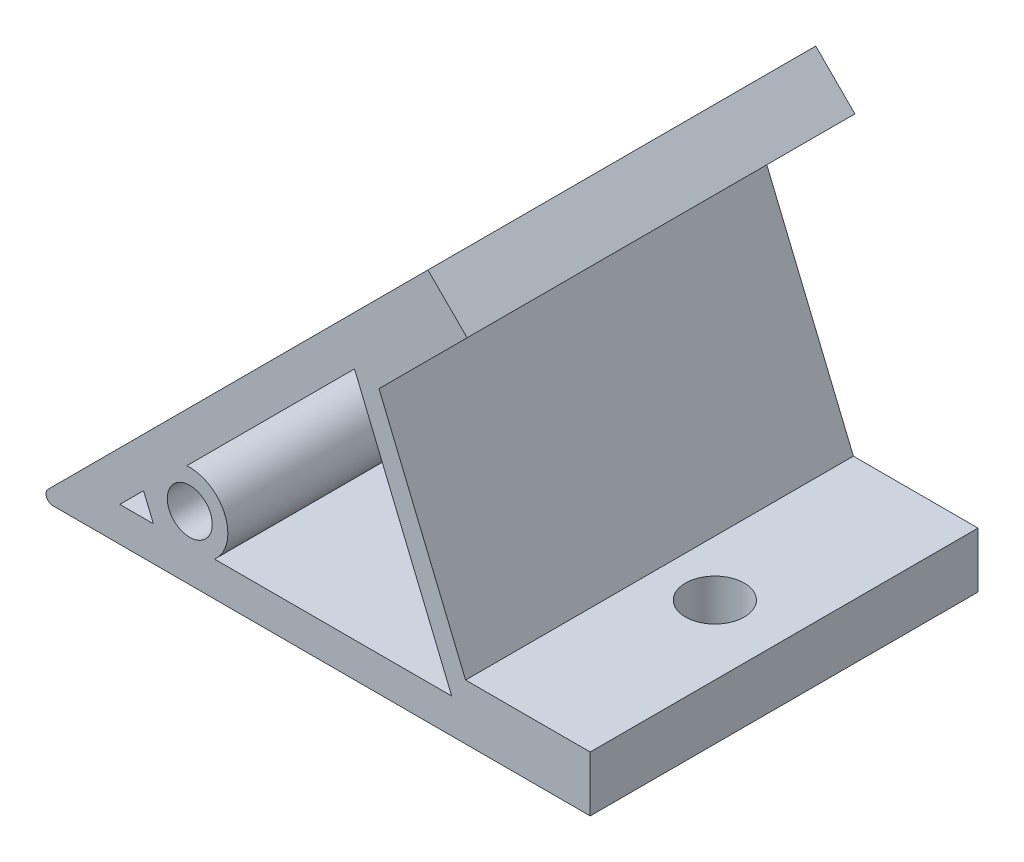
ISO-10303-21;
HEADER;
FILE_DESCRIPTION(('STEP AP214'),'2;1');
FILE_NAME('part.step','',(''),(''),'','','');
FILE_SCHEMA(('AUTOMOTIVE_DESIGN { 1 0 10303 214 1 1 1 1 }'));
ENDSEC;
DATA;
#1=APPLICATION_CONTEXT('core data for automotive mechanical design processes');
#2=APPLICATION_PROTOCOL_DEFINITION('international standard','automotive_design',2000,#1);
#3=PRODUCT_CONTEXT('',#1,'mechanical');
#4=PRODUCT('Part','Part','',(#3));
#5=PRODUCT_RELATED_PRODUCT_CATEGORY('part','',(#4));
#6=PRODUCT_DEFINITION_FORMATION('','',#4);
#7=PRODUCT_DEFINITION_CONTEXT('part definition',#1,'design');
#8=PRODUCT_DEFINITION('design','',#6,#7);
#9=PRODUCT_DEFINITION_SHAPE('','',#8);
#10=(LENGTH_UNIT() NAMED_UNIT(*) SI_UNIT(.MILLI.,.METRE.));
#11=(NAMED_UNIT(*) PLANE_ANGLE_UNIT() SI_UNIT($,.RADIAN.));
#12=(NAMED_UNIT(*) SI_UNIT($,.STERADIAN.) SOLID_ANGLE_UNIT());
#13=UNCERTAINTY_MEASURE_WITH_UNIT(LENGTH_MEASURE(1.E-05),#10,'distance_accuracy_value','');
#14=(GEOMETRIC_REPRESENTATION_CONTEXT(3) GLOBAL_UNCERTAINTY_ASSIGNED_CONTEXT((#13)) GLOBAL_UNIT_ASSIGNED_CONTEXT((#10,
#11,#12)) REPRESENTATION_CONTEXT('',''));
#15=CARTESIAN_POINT('',(0.,0.,0.));
#16=DIRECTION('',(0.,0.,1.));
#17=DIRECTION('',(1.,0.,0.));
#18=AXIS2_PLACEMENT_3D('',#15,#16,#17);
#19=CARTESIAN_POINT('',(-30.4993179415646,38.1869735594505,28.));
#20=DIRECTION('',(-0.707106781186548,0.707106781186547,0.));
#21=DIRECTION('',(-0.707106781186547,-0.707106781186548,0.));
#22=AXIS2_PLACEMENT_3D('',#19,#20,#21);
#23=PLANE('',#22);
#24=DIRECTION('',(0.707106781186547,0.707106781186548,0.));
#25=VECTOR('',#24,1.);
#26=CARTESIAN_POINT('',(-30.4993179415646,38.1869735594505,-28.));
#27=LINE('',#26,#25);
#28=CARTESIAN_POINT('',(-30.4993179415646,38.1869735594505,-28.));
#29=VERTEX_POINT('',#28);
#30=CARTESIAN_POINT('',(-17.7746032555838,50.9116882454314,-28.));
#31=VERTEX_POINT('',#30);
#32=EDGE_CURVE('E236',#29,#31,#27,.T.);
#33=ORIENTED_EDGE('',*,*,#32,.T.);
#34=DIRECTION('',(0.,0.,-1.));
#35=VECTOR('',#34,1.);
#36=CARTESIAN_POINT('',(-17.7746032555838,50.9116882454314,28.));
#37=LINE('',#36,#35);
#38=CARTESIAN_POINT('',(-17.7746032555838,50.9116882454314,28.));
#39=VERTEX_POINT('',#38);
#40=EDGE_CURVE('E246',#39,#31,#37,.T.);
#41=ORIENTED_EDGE('',*,*,#40,.F.);
#42=DIRECTION('',(0.707106781186547,0.707106781186548,0.));
#43=VECTOR('',#42,1.);
#44=CARTESIAN_POINT('',(-30.4993179415646,38.1869735594505,28.));
#45=LINE('',#44,#43);
#46=CARTESIAN_POINT('',(-30.4993179415646,38.1869735594505,28.));
#47=VERTEX_POINT('',#46);
#48=EDGE_CURVE('E219',#47,#39,#45,.T.);
#49=ORIENTED_EDGE('',*,*,#48,.F.);
#50=DIRECTION('',(0.,0.,-1.));
#51=VECTOR('',#50,1.);
#52=CARTESIAN_POINT('',(-30.4993179415646,38.1869735594505,28.));
#53=LINE('',#52,#51);
#54=EDGE_CURVE('E249',#47,#29,#53,.T.);
#55=ORIENTED_EDGE('',*,*,#54,.T.);
#56=EDGE_LOOP('',(#33,#41,#49,#55));
#57=FACE_BOUND('',#56,.T.);
#58=CARTESIAN_POINT('',(-24.8456710674492,43.8406204335659,0.));
#59=DIRECTION('',(-0.70710678118655,0.707106781186545,0.));
#60=DIRECTION('',(-0.707106781186546,-0.707106781186549,0.));
#61=AXIS2_PLACEMENT_3D('',#58,#59,#60);
#62=CIRCLE('',#61,4.25);
#63=CARTESIAN_POINT('',(-27.850874887492,40.835416613523,0.));
#64=VERTEX_POINT('',#63);
#65=EDGE_CURVE('E305',#64,#64,#62,.T.);
#66=ORIENTED_EDGE('',*,*,#65,.T.);
#67=EDGE_LOOP('',(#66));
#68=FACE_BOUND('',#67,.T.);
#69=ADVANCED_FACE('F35',(#57,#68),#23,.F.);
#70=CARTESIAN_POINT('',(-78.2928932188134,1.7071067811866,28.));
#71=DIRECTION('',(0.707106781186548,-0.707106781186548,0.));
#72=DIRECTION('',(0.707106781186547,0.707106781186548,0.));
#73=AXIS2_PLACEMENT_3D('',#70,#71,#72);
#74=PLANE('',#73);
#75=DIRECTION('',(-0.707106781186547,-0.707106781186548,0.));
#76=VECTOR('',#75,1.);
#77=CARTESIAN_POINT('',(-78.2928932188134,1.7071067811866,-28.));
#78=LINE('',#77,#76);
#79=CARTESIAN_POINT('',(-23.4314575050762,56.5685424949238,-28.));
#80=VERTEX_POINT('',#79);
#81=CARTESIAN_POINT('',(-78.2928932188134,1.7071067811866,-28.));
#82=VERTEX_POINT('',#81);
#83=EDGE_CURVE('E211',#80,#82,#78,.T.);
#84=ORIENTED_EDGE('',*,*,#83,.T.);
#85=DIRECTION('',(0.,0.,-1.));
#86=VECTOR('',#85,1.);
#87=CARTESIAN_POINT('',(-78.2928932188134,1.7071067811866,28.));
#88=LINE('',#87,#86);
#89=CARTESIAN_POINT('',(-78.2928932188134,1.7071067811866,28.));
#90=VERTEX_POINT('',#89);
#91=EDGE_CURVE('E225',#90,#82,#88,.T.);
#92=ORIENTED_EDGE('',*,*,#91,.F.);
#93=DIRECTION('',(-0.707106781186547,-0.707106781186548,0.));
#94=VECTOR('',#93,1.);
#95=CARTESIAN_POINT('',(-78.2928932188134,1.7071067811866,28.));
#96=LINE('',#95,#94);
#97=CARTESIAN_POINT('',(-23.4314575050762,56.5685424949238,28.));
#98=VERTEX_POINT('',#97);
#99=EDGE_CURVE('E223',#98,#90,#96,.T.);
#100=ORIENTED_EDGE('',*,*,#99,.F.);
#101=DIRECTION('',(0.,0.,-1.));
#102=VECTOR('',#101,1.);
#103=CARTESIAN_POINT('',(-23.4314575050762,56.5685424949238,28.));
#104=LINE('',#103,#102);
#105=EDGE_CURVE('E243',#98,#80,#104,.T.);
#106=ORIENTED_EDGE('',*,*,#105,.T.);
#107=EDGE_LOOP('',(#84,#92,#100,#106));
#108=FACE_BOUND('',#107,.T.);
#109=CARTESIAN_POINT('',(-30.5025253169417,49.4974746830583,0.));
#110=DIRECTION('',(0.707106781186548,-0.707106781186548,0.));
#111=DIRECTION('',(0.707106781186547,0.707106781186548,0.));
#112=AXIS2_PLACEMENT_3D('',#109,#110,#111);
#113=CIRCLE('',#112,4.25);
#114=CARTESIAN_POINT('',(-27.4973214968988,52.5026785031012,0.));
#115=VERTEX_POINT('',#114);
#116=EDGE_CURVE('E39',#115,#115,#113,.F.);
#117=ORIENTED_EDGE('',*,*,#116,.F.);
#118=EDGE_LOOP('',(#117));
#119=FACE_BOUND('',#118,.T.);
#120=ADVANCED_FACE('F292',(#108,#119),#74,.F.);
#121=CARTESIAN_POINT('',(-77.5857864376269,1.,28.));
#122=DIRECTION('',(0.,0.,1.));
#123=DIRECTION('',(1.,0.,0.));
#124=AXIS2_PLACEMENT_3D('',#121,#122,#123);
#125=PLANE('',#124);
#126=DIRECTION('',(1.,0.,0.));
#127=VECTOR('',#126,1.);
#128=CARTESIAN_POINT('',(-54.2574687525298,5.,28.));
#129=LINE('',#128,#127);
#130=CARTESIAN_POINT('',(-54.2574687525298,5.,28.));
#131=VERTEX_POINT('',#130);
#132=CARTESIAN_POINT('',(-20.,5.,28.));
#133=VERTEX_POINT('',#132);
#134=EDGE_CURVE('E151',#131,#133,#129,.T.);
#135=ORIENTED_EDGE('',*,*,#134,.F.);
#136=CARTESIAN_POINT('',(-57.8268912197291,9.18440237676214,28.));
#137=DIRECTION('',(0.,0.,-1.));
#138=DIRECTION('',(1.,0.,0.));
#139=AXIS2_PLACEMENT_3D('',#136,#137,#138);
#140=CIRCLE('',#139,5.49999999999996);
#141=CARTESIAN_POINT('',(-58.2617476840749,14.6671845040599,28.));
#142=VERTEX_POINT('',#141);
#143=EDGE_CURVE('E143',#142,#131,#140,.T.);
#144=ORIENTED_EDGE('',*,*,#143,.F.);
#145=DIRECTION('',(-0.707106781186549,-0.707106781186546,0.));
#146=VECTOR('',#145,1.);
#147=CARTESIAN_POINT('',(-58.2617476840749,14.6671845040599,28.));
#148=LINE('',#147,#146);
#149=CARTESIAN_POINT('',(-34.0380592228744,38.8908729652603,28.));
#150=VERTEX_POINT('',#149);
#151=EDGE_CURVE('E167',#150,#142,#148,.T.);
#152=ORIENTED_EDGE('',*,*,#151,.F.);
#153=DIRECTION('',(-0.382683432365087,0.923879532511288,0.));
#154=VECTOR('',#153,1.);
#155=CARTESIAN_POINT('',(-20.,5.,28.));
#156=LINE('',#155,#154);
#157=EDGE_CURVE('E165',#133,#150,#156,.T.);
#158=ORIENTED_EDGE('',*,*,#157,.F.);
#159=EDGE_LOOP('',(#135,#144,#152,#158));
#160=FACE_BOUND('',#159,.T.);
#161=CARTESIAN_POINT('',(-77.5857864376269,1.,28.));
#162=DIRECTION('',(0.,0.,1.));
#163=DIRECTION('',(1.,0.,0.));
#164=AXIS2_PLACEMENT_3D('',#161,#162,#163);
#165=CIRCLE('',#164,1.);
#166=CARTESIAN_POINT('',(-77.5857864376269,0.,28.));
#167=VERTEX_POINT('',#166);
#168=EDGE_CURVE('E207',#90,#167,#165,.T.);
#169=ORIENTED_EDGE('',*,*,#168,.T.);
#170=DIRECTION('',(1.,0.,0.));
#171=VECTOR('',#170,1.);
#172=CARTESIAN_POINT('',(-77.5857864376269,0.,28.));
#173=LINE('',#172,#171);
#174=CARTESIAN_POINT('',(0.,0.,28.));
#175=VERTEX_POINT('',#174);
#176=EDGE_CURVE('E210',#167,#175,#173,.T.);
#177=ORIENTED_EDGE('',*,*,#176,.T.);
#178=DIRECTION('',(0.,1.,0.));
#179=VECTOR('',#178,1.);
#180=CARTESIAN_POINT('',(0.,0.,28.));
#181=LINE('',#180,#179);
#182=CARTESIAN_POINT('',(0.,8.,28.));
#183=VERTEX_POINT('',#182);
#184=EDGE_CURVE('E213',#175,#183,#181,.T.);
#185=ORIENTED_EDGE('',*,*,#184,.T.);
#186=DIRECTION('',(-1.,0.,0.));
#187=VECTOR('',#186,1.);
#188=CARTESIAN_POINT('',(-17.995464086242,8.00000000000012,28.));
#189=LINE('',#188,#187);
#190=CARTESIAN_POINT('',(-17.995464086242,8.00000000000012,28.));
#191=VERTEX_POINT('',#190);
#192=EDGE_CURVE('E215',#183,#191,#189,.T.);
#193=ORIENTED_EDGE('',*,*,#192,.T.);
#194=DIRECTION('',(-0.382683432365096,0.923879532511284,0.));
#195=VECTOR('',#194,1.);
#196=CARTESIAN_POINT('',(-17.995464086242,8.00000000000012,28.));
#197=LINE('',#196,#195);
#198=EDGE_CURVE('E217',#191,#47,#197,.T.);
#199=ORIENTED_EDGE('',*,*,#198,.T.);
#200=ORIENTED_EDGE('',*,*,#48,.T.);
#201=DIRECTION('',(-0.707106781186548,0.707106781186547,0.));
#202=VECTOR('',#201,1.);
#203=CARTESIAN_POINT('',(-17.7746032555838,50.9116882454314,28.));
#204=LINE('',#203,#202);
#205=EDGE_CURVE('E221',#39,#98,#204,.T.);
#206=ORIENTED_EDGE('',*,*,#205,.T.);
#207=ORIENTED_EDGE('',*,*,#99,.T.);
#208=EDGE_LOOP('',(#169,#177,#185,#193,#199,#200,#206,#207));
#209=FACE_BOUND('',#208,.T.);
#210=DIRECTION('',(1.,0.,0.));
#211=VECTOR('',#210,1.);
#212=CARTESIAN_POINT('',(-67.9289321881347,5.,28.));
#213=LINE('',#212,#211);
#214=CARTESIAN_POINT('',(-67.9289321881347,5.,28.));
#215=VERTEX_POINT('',#214);
#216=CARTESIAN_POINT('',(-63.0744704704145,5.00000000000011,28.));
#217=VERTEX_POINT('',#216);
#218=EDGE_CURVE('E185',#215,#217,#213,.T.);
#219=ORIENTED_EDGE('',*,*,#218,.F.);
#220=DIRECTION('',(-0.70710678118656,-0.707106781186535,0.));
#221=VECTOR('',#220,1.);
#222=CARTESIAN_POINT('',(-67.9289321881347,5.,28.));
#223=LINE('',#222,#221);
#224=CARTESIAN_POINT('',(-64.4963093885244,8.43262279961016,28.));
#225=VERTEX_POINT('',#224);
#226=EDGE_CURVE('E183',#225,#215,#223,.T.);
#227=ORIENTED_EDGE('',*,*,#226,.F.);
#228=DIRECTION('',(-0.382683432365157,0.923879532511259,0.));
#229=VECTOR('',#228,1.);
#230=CARTESIAN_POINT('',(-63.0744704704145,5.00000000000011,28.));
#231=LINE('',#230,#229);
#232=EDGE_CURVE('E189',#217,#225,#231,.T.);
#233=ORIENTED_EDGE('',*,*,#232,.F.);
#234=EDGE_LOOP('',(#219,#227,#233));
#235=FACE_BOUND('',#234,.T.);
#236=CARTESIAN_POINT('',(-57.8268912197291,9.18440237676214,28.));
#237=DIRECTION('',(0.,0.,1.));
#238=DIRECTION('',(1.,0.,0.));
#239=AXIS2_PLACEMENT_3D('',#236,#237,#238);
#240=CIRCLE('',#239,3.25);
#241=CARTESIAN_POINT('',(-54.5768912197291,9.18440237676214,28.));
#242=VERTEX_POINT('',#241);
#243=EDGE_CURVE('E173',#242,#242,#240,.T.);
#244=ORIENTED_EDGE('',*,*,#243,.F.);
#245=EDGE_LOOP('',(#244));
#246=FACE_BOUND('',#245,.T.);
#247=ADVANCED_FACE('F163',(#160,#209,#235,#246),#125,.T.);
#248=CARTESIAN_POINT('',(-77.5857864376269,1.,-28.));
#249=DIRECTION('',(0.,0.,1.));
#250=DIRECTION('',(1.,0.,0.));
#251=AXIS2_PLACEMENT_3D('',#248,#249,#250);
#252=PLANE('',#251);
#253=CARTESIAN_POINT('',(-57.8268912197291,9.18440237676214,-28.));
#254=DIRECTION('',(0.,0.,-1.));
#255=DIRECTION('',(1.,0.,0.));
#256=AXIS2_PLACEMENT_3D('',#253,#254,#255);
#257=CIRCLE('',#256,5.49999999999996);
#258=CARTESIAN_POINT('',(-58.2617476840749,14.6671845040599,-28.));
#259=VERTEX_POINT('',#258);
#260=CARTESIAN_POINT('',(-54.2574687525298,5.,-28.));
#261=VERTEX_POINT('',#260);
#262=EDGE_CURVE('E59',#259,#261,#257,.T.);
#263=ORIENTED_EDGE('',*,*,#262,.T.);
#264=DIRECTION('',(1.,0.,0.));
#265=VECTOR('',#264,1.);
#266=CARTESIAN_POINT('',(-54.2574687525298,5.,-28.));
#267=LINE('',#266,#265);
#268=CARTESIAN_POINT('',(-20.,5.,-28.));
#269=VERTEX_POINT('',#268);
#270=EDGE_CURVE('E158',#261,#269,#267,.T.);
#271=ORIENTED_EDGE('',*,*,#270,.T.);
#272=DIRECTION('',(-0.382683432365087,0.923879532511288,0.));
#273=VECTOR('',#272,1.);
#274=CARTESIAN_POINT('',(-20.,5.,-28.));
#275=LINE('',#274,#273);
#276=CARTESIAN_POINT('',(-34.0380592228744,38.8908729652603,-28.));
#277=VERTEX_POINT('',#276);
#278=EDGE_CURVE('E175',#269,#277,#275,.T.);
#279=ORIENTED_EDGE('',*,*,#278,.T.);
#280=DIRECTION('',(-0.707106781186549,-0.707106781186546,0.));
#281=VECTOR('',#280,1.);
#282=CARTESIAN_POINT('',(-58.2617476840749,14.6671845040599,-28.));
#283=LINE('',#282,#281);
#284=EDGE_CURVE('E152',#277,#259,#283,.T.);
#285=ORIENTED_EDGE('',*,*,#284,.T.);
#286=EDGE_LOOP('',(#263,#271,#279,#285));
#287=FACE_BOUND('',#286,.T.);
#288=CARTESIAN_POINT('',(-77.5857864376269,1.,-28.));
#289=DIRECTION('',(0.,0.,1.));
#290=DIRECTION('',(1.,0.,0.));
#291=AXIS2_PLACEMENT_3D('',#288,#289,#290);
#292=CIRCLE('',#291,1.);
#293=CARTESIAN_POINT('',(-77.5857864376269,0.,-28.));
#294=VERTEX_POINT('',#293);
#295=EDGE_CURVE('E206',#82,#294,#292,.T.);
#296=ORIENTED_EDGE('',*,*,#295,.F.);
#297=ORIENTED_EDGE('',*,*,#83,.F.);
#298=DIRECTION('',(-0.707106781186548,0.707106781186547,0.));
#299=VECTOR('',#298,1.);
#300=CARTESIAN_POINT('',(-17.7746032555838,50.9116882454314,-28.));
#301=LINE('',#300,#299);
#302=EDGE_CURVE('E238',#31,#80,#301,.T.);
#303=ORIENTED_EDGE('',*,*,#302,.F.);
#304=ORIENTED_EDGE('',*,*,#32,.F.);
#305=DIRECTION('',(-0.382683432365096,0.923879532511284,0.));
#306=VECTOR('',#305,1.);
#307=CARTESIAN_POINT('',(-17.995464086242,8.00000000000012,-28.));
#308=LINE('',#307,#306);
#309=CARTESIAN_POINT('',(-17.995464086242,8.00000000000012,-28.));
#310=VERTEX_POINT('',#309);
#311=EDGE_CURVE('E234',#310,#29,#308,.T.);
#312=ORIENTED_EDGE('',*,*,#311,.F.);
#313=DIRECTION('',(-1.,0.,0.));
#314=VECTOR('',#313,1.);
#315=CARTESIAN_POINT('',(-17.995464086242,8.00000000000012,-28.));
#316=LINE('',#315,#314);
#317=CARTESIAN_POINT('',(0.,8.,-28.));
#318=VERTEX_POINT('',#317);
#319=EDGE_CURVE('E232',#318,#310,#316,.T.);
#320=ORIENTED_EDGE('',*,*,#319,.F.);
#321=DIRECTION('',(0.,1.,0.));
#322=VECTOR('',#321,1.);
#323=CARTESIAN_POINT('',(0.,0.,-28.));
#324=LINE('',#323,#322);
#325=CARTESIAN_POINT('',(0.,0.,-28.));
#326=VERTEX_POINT('',#325);
#327=EDGE_CURVE('E230',#326,#318,#324,.T.);
#328=ORIENTED_EDGE('',*,*,#327,.F.);
#329=DIRECTION('',(1.,0.,0.));
#330=VECTOR('',#329,1.);
#331=CARTESIAN_POINT('',(-77.5857864376269,0.,-28.));
#332=LINE('',#331,#330);
#333=EDGE_CURVE('E228',#294,#326,#332,.T.);
#334=ORIENTED_EDGE('',*,*,#333,.F.);
#335=EDGE_LOOP('',(#296,#297,#303,#304,#312,#320,#328,#334));
#336=FACE_BOUND('',#335,.T.);
#337=DIRECTION('',(-0.70710678118656,-0.707106781186535,0.));
#338=VECTOR('',#337,1.);
#339=CARTESIAN_POINT('',(-67.9289321881347,5.,-28.));
#340=LINE('',#339,#338);
#341=CARTESIAN_POINT('',(-64.4963093885244,8.43262279961016,-28.));
#342=VERTEX_POINT('',#341);
#343=CARTESIAN_POINT('',(-67.9289321881347,5.,-28.));
#344=VERTEX_POINT('',#343);
#345=EDGE_CURVE('E159',#342,#344,#340,.T.);
#346=ORIENTED_EDGE('',*,*,#345,.T.);
#347=DIRECTION('',(1.,0.,0.));
#348=VECTOR('',#347,1.);
#349=CARTESIAN_POINT('',(-67.9289321881347,5.,-28.));
#350=LINE('',#349,#348);
#351=CARTESIAN_POINT('',(-63.0744704704145,5.00000000000011,-28.));
#352=VERTEX_POINT('',#351);
#353=EDGE_CURVE('E194',#344,#352,#350,.T.);
#354=ORIENTED_EDGE('',*,*,#353,.T.);
#355=DIRECTION('',(-0.382683432365157,0.923879532511259,0.));
#356=VECTOR('',#355,1.);
#357=CARTESIAN_POINT('',(-63.0744704704145,5.00000000000011,-28.));
#358=LINE('',#357,#356);
#359=EDGE_CURVE('E186',#352,#342,#358,.T.);
#360=ORIENTED_EDGE('',*,*,#359,.T.);
#361=EDGE_LOOP('',(#346,#354,#360));
#362=FACE_BOUND('',#361,.T.);
#363=CARTESIAN_POINT('',(-57.8268912197291,9.18440237676214,-28.));
#364=DIRECTION('',(0.,0.,1.));
#365=DIRECTION('',(1.,0.,0.));
#366=AXIS2_PLACEMENT_3D('',#363,#364,#365);
#367=CIRCLE('',#366,3.25);
#368=CARTESIAN_POINT('',(-54.5768912197291,9.18440237676214,-28.));
#369=VERTEX_POINT('',#368);
#370=EDGE_CURVE('E316',#369,#369,#367,.T.);
#371=ORIENTED_EDGE('',*,*,#370,.T.);
#372=EDGE_LOOP('',(#371));
#373=FACE_BOUND('',#372,.T.);
#374=ADVANCED_FACE('F269',(#287,#336,#362,#373),#252,.F.);
#375=CARTESIAN_POINT('',(-77.5857864376269,1.,28.));
#376=DIRECTION('',(0.,0.,-1.));
#377=DIRECTION('',(-1.,0.,0.));
#378=AXIS2_PLACEMENT_3D('',#375,#376,#377);
#379=CYLINDRICAL_SURFACE('',#378,1.);
#380=ORIENTED_EDGE('',*,*,#295,.T.);
#381=DIRECTION('',(0.,0.,-1.));
#382=VECTOR('',#381,1.);
#383=CARTESIAN_POINT('',(-77.5857864376269,0.,28.));
#384=LINE('',#383,#382);
#385=EDGE_CURVE('E11',#167,#294,#384,.T.);
#386=ORIENTED_EDGE('',*,*,#385,.F.);
#387=ORIENTED_EDGE('',*,*,#168,.F.);
#388=ORIENTED_EDGE('',*,*,#91,.T.);
#389=EDGE_LOOP('',(#380,#386,#387,#388));
#390=FACE_BOUND('',#389,.T.);
#391=ADVANCED_FACE('F37',(#390),#379,.T.);
#392=CARTESIAN_POINT('',(-77.5857864376269,0.,28.));
#393=DIRECTION('',(0.,1.,0.));
#394=DIRECTION('',(0.,0.,1.));
#395=AXIS2_PLACEMENT_3D('',#392,#393,#394);
#396=PLANE('',#395);
#397=CARTESIAN_POINT('',(-10.,0.,0.));
#398=DIRECTION('',(0.,1.,0.));
#399=DIRECTION('',(0.,0.,1.));
#400=AXIS2_PLACEMENT_3D('',#397,#398,#399);
#401=CIRCLE('',#400,4.25);
#402=CARTESIAN_POINT('',(-10.,0.,4.25));
#403=VERTEX_POINT('',#402);
#404=EDGE_CURVE('E313',#403,#403,#401,.T.);
#405=ORIENTED_EDGE('',*,*,#404,.T.);
#406=EDGE_LOOP('',(#405));
#407=FACE_BOUND('',#406,.T.);
#408=ORIENTED_EDGE('',*,*,#333,.T.);
#409=DIRECTION('',(0.,0.,-1.));
#410=VECTOR('',#409,1.);
#411=CARTESIAN_POINT('',(0.,0.,28.));
#412=LINE('',#411,#410);
#413=EDGE_CURVE('E44',#175,#326,#412,.T.);
#414=ORIENTED_EDGE('',*,*,#413,.F.);
#415=ORIENTED_EDGE('',*,*,#176,.F.);
#416=ORIENTED_EDGE('',*,*,#385,.T.);
#417=EDGE_LOOP('',(#408,#414,#415,#416));
#418=FACE_BOUND('',#417,.T.);
#419=ADVANCED_FACE('F286',(#407,#418),#396,.F.);
#420=CARTESIAN_POINT('',(0.,0.,28.));
#421=DIRECTION('',(-1.,0.,0.));
#422=DIRECTION('',(0.,0.,1.));
#423=AXIS2_PLACEMENT_3D('',#420,#421,#422);
#424=PLANE('',#423);
#425=ORIENTED_EDGE('',*,*,#327,.T.);
#426=DIRECTION('',(0.,0.,-1.));
#427=VECTOR('',#426,1.);
#428=CARTESIAN_POINT('',(0.,8.,28.));
#429=LINE('',#428,#427);
#430=EDGE_CURVE('E255',#183,#318,#429,.T.);
#431=ORIENTED_EDGE('',*,*,#430,.F.);
#432=ORIENTED_EDGE('',*,*,#184,.F.);
#433=ORIENTED_EDGE('',*,*,#413,.T.);
#434=EDGE_LOOP('',(#425,#431,#432,#433));
#435=FACE_BOUND('',#434,.T.);
#436=ADVANCED_FACE('F263',(#435),#424,.F.);
#437=CARTESIAN_POINT('',(-17.995464086242,8.00000000000012,28.));
#438=DIRECTION('',(0.,-1.,0.));
#439=DIRECTION('',(1.,0.,0.));
#440=AXIS2_PLACEMENT_3D('',#437,#438,#439);
#441=PLANE('',#440);
#442=CARTESIAN_POINT('',(-10.,8.00000000000006,0.));
#443=DIRECTION('',(0.,1.,0.));
#444=DIRECTION('',(-1.,0.,0.));
#445=AXIS2_PLACEMENT_3D('',#442,#443,#444);
#446=CIRCLE('',#445,4.25);
#447=CARTESIAN_POINT('',(-14.25,8.00000000000009,0.));
#448=VERTEX_POINT('',#447);
#449=EDGE_CURVE('E309',#448,#448,#446,.T.);
#450=ORIENTED_EDGE('',*,*,#449,.F.);
#451=EDGE_LOOP('',(#450));
#452=FACE_BOUND('',#451,.T.);
#453=ORIENTED_EDGE('',*,*,#319,.T.);
#454=DIRECTION('',(0.,0.,-1.));
#455=VECTOR('',#454,1.);
#456=CARTESIAN_POINT('',(-17.995464086242,8.00000000000012,28.));
#457=LINE('',#456,#455);
#458=EDGE_CURVE('E252',#191,#310,#457,.T.);
#459=ORIENTED_EDGE('',*,*,#458,.F.);
#460=ORIENTED_EDGE('',*,*,#192,.F.);
#461=ORIENTED_EDGE('',*,*,#430,.T.);
#462=EDGE_LOOP('',(#453,#459,#460,#461));
#463=FACE_BOUND('',#462,.T.);
#464=ADVANCED_FACE('F275',(#452,#463),#441,.F.);
#465=CARTESIAN_POINT('',(-17.995464086242,8.00000000000012,28.));
#466=DIRECTION('',(-0.923879532511284,-0.382683432365096,0.));
#467=DIRECTION('',(0.382683432365096,-0.923879532511284,0.));
#468=AXIS2_PLACEMENT_3D('',#465,#466,#467);
#469=PLANE('',#468);
#470=ORIENTED_EDGE('',*,*,#311,.T.);
#471=ORIENTED_EDGE('',*,*,#54,.F.);
#472=ORIENTED_EDGE('',*,*,#198,.F.);
#473=ORIENTED_EDGE('',*,*,#458,.T.);
#474=EDGE_LOOP('',(#470,#471,#472,#473));
#475=FACE_BOUND('',#474,.T.);
#476=ADVANCED_FACE('F279',(#475),#469,.F.);
#477=CARTESIAN_POINT('',(-17.7746032555838,50.9116882454314,28.));
#478=DIRECTION('',(-0.707106781186547,-0.707106781186548,0.));
#479=DIRECTION('',(0.707106781186548,-0.707106781186547,0.));
#480=AXIS2_PLACEMENT_3D('',#477,#478,#479);
#481=PLANE('',#480);
#482=ORIENTED_EDGE('',*,*,#302,.T.);
#483=ORIENTED_EDGE('',*,*,#105,.F.);
#484=ORIENTED_EDGE('',*,*,#205,.F.);
#485=ORIENTED_EDGE('',*,*,#40,.T.);
#486=EDGE_LOOP('',(#482,#483,#484,#485));
#487=FACE_BOUND('',#486,.T.);
#488=ADVANCED_FACE('F298',(#487),#481,.F.);
#489=CARTESIAN_POINT('',(-67.9289321881347,5.,28.));
#490=DIRECTION('',(0.707106781186535,-0.70710678118656,0.));
#491=DIRECTION('',(0.70710678118656,0.707106781186535,0.));
#492=AXIS2_PLACEMENT_3D('',#489,#490,#491);
#493=PLANE('',#492);
#494=ORIENTED_EDGE('',*,*,#345,.F.);
#495=DIRECTION('',(0.,0.,-1.));
#496=VECTOR('',#495,1.);
#497=CARTESIAN_POINT('',(-64.4963093885244,8.43262279961016,28.));
#498=LINE('',#497,#496);
#499=EDGE_CURVE('E191',#225,#342,#498,.T.);
#500=ORIENTED_EDGE('',*,*,#499,.F.);
#501=ORIENTED_EDGE('',*,*,#226,.T.);
#502=DIRECTION('',(0.,0.,-1.));
#503=VECTOR('',#502,1.);
#504=CARTESIAN_POINT('',(-67.9289321881347,5.,28.));
#505=LINE('',#504,#503);
#506=EDGE_CURVE('E203',#215,#344,#505,.T.);
#507=ORIENTED_EDGE('',*,*,#506,.T.);
#508=EDGE_LOOP('',(#494,#500,#501,#507));
#509=FACE_BOUND('',#508,.T.);
#510=ADVANCED_FACE('F353',(#509),#493,.T.);
#511=CARTESIAN_POINT('',(-67.9289321881347,5.,28.));
#512=DIRECTION('',(0.,1.,0.));
#513=DIRECTION('',(-1.,0.,0.));
#514=AXIS2_PLACEMENT_3D('',#511,#512,#513);
#515=PLANE('',#514);
#516=ORIENTED_EDGE('',*,*,#353,.F.);
#517=ORIENTED_EDGE('',*,*,#506,.F.);
#518=ORIENTED_EDGE('',*,*,#218,.T.);
#519=DIRECTION('',(0.,0.,-1.));
#520=VECTOR('',#519,1.);
#521=CARTESIAN_POINT('',(-63.0744704704145,5.00000000000011,28.));
#522=LINE('',#521,#520);
#523=EDGE_CURVE('E201',#217,#352,#522,.T.);
#524=ORIENTED_EDGE('',*,*,#523,.T.);
#525=EDGE_LOOP('',(#516,#517,#518,#524));
#526=FACE_BOUND('',#525,.T.);
#527=ADVANCED_FACE('F349',(#526),#515,.T.);
#528=CARTESIAN_POINT('',(-63.0744704704145,5.00000000000011,28.));
#529=DIRECTION('',(-0.923879532511259,-0.382683432365157,0.));
#530=DIRECTION('',(0.382683432365157,-0.923879532511259,0.));
#531=AXIS2_PLACEMENT_3D('',#528,#529,#530);
#532=PLANE('',#531);
#533=ORIENTED_EDGE('',*,*,#359,.F.);
#534=ORIENTED_EDGE('',*,*,#523,.F.);
#535=ORIENTED_EDGE('',*,*,#232,.T.);
#536=ORIENTED_EDGE('',*,*,#499,.T.);
#537=EDGE_LOOP('',(#533,#534,#535,#536));
#538=FACE_BOUND('',#537,.T.);
#539=ADVANCED_FACE('F346',(#538),#532,.T.);
#540=CARTESIAN_POINT('',(-57.8268912197291,9.18440237676214,28.));
#541=DIRECTION('',(0.,0.,-1.));
#542=DIRECTION('',(-1.,0.,0.));
#543=AXIS2_PLACEMENT_3D('',#540,#541,#542);
#544=CYLINDRICAL_SURFACE('',#543,5.49999999999996);
#545=ORIENTED_EDGE('',*,*,#262,.F.);
#546=DIRECTION('',(0.,0.,-1.));
#547=VECTOR('',#546,1.);
#548=CARTESIAN_POINT('',(-58.2617476840749,14.6671845040599,28.));
#549=LINE('',#548,#547);
#550=EDGE_CURVE('E147',#142,#259,#549,.T.);
#551=ORIENTED_EDGE('',*,*,#550,.F.);
#552=ORIENTED_EDGE('',*,*,#143,.T.);
#553=DIRECTION('',(0.,0.,-1.));
#554=VECTOR('',#553,1.);
#555=CARTESIAN_POINT('',(-54.2574687525298,5.,28.));
#556=LINE('',#555,#554);
#557=EDGE_CURVE('E146',#131,#261,#556,.T.);
#558=ORIENTED_EDGE('',*,*,#557,.T.);
#559=EDGE_LOOP('',(#545,#551,#552,#558));
#560=FACE_BOUND('',#559,.T.);
#561=ADVANCED_FACE('F145',(#560),#544,.T.);
#562=CARTESIAN_POINT('',(-54.2574687525298,5.,28.));
#563=DIRECTION('',(0.,1.,0.));
#564=DIRECTION('',(0.,0.,1.));
#565=AXIS2_PLACEMENT_3D('',#562,#563,#564);
#566=PLANE('',#565);
#567=ORIENTED_EDGE('',*,*,#270,.F.);
#568=ORIENTED_EDGE('',*,*,#557,.F.);
#569=ORIENTED_EDGE('',*,*,#134,.T.);
#570=DIRECTION('',(0.,0.,-1.));
#571=VECTOR('',#570,1.);
#572=CARTESIAN_POINT('',(-20.,5.,28.));
#573=LINE('',#572,#571);
#574=EDGE_CURVE('E160',#133,#269,#573,.T.);
#575=ORIENTED_EDGE('',*,*,#574,.T.);
#576=EDGE_LOOP('',(#567,#568,#569,#575));
#577=FACE_BOUND('',#576,.T.);
#578=ADVANCED_FACE('F155',(#577),#566,.T.);
#579=CARTESIAN_POINT('',(-20.,5.,28.));
#580=DIRECTION('',(-0.923879532511288,-0.382683432365087,0.));
#581=DIRECTION('',(0.382683432365087,-0.923879532511288,0.));
#582=AXIS2_PLACEMENT_3D('',#579,#580,#581);
#583=PLANE('',#582);
#584=ORIENTED_EDGE('',*,*,#278,.F.);
#585=ORIENTED_EDGE('',*,*,#574,.F.);
#586=ORIENTED_EDGE('',*,*,#157,.T.);
#587=DIRECTION('',(0.,0.,-1.));
#588=VECTOR('',#587,1.);
#589=CARTESIAN_POINT('',(-34.0380592228744,38.8908729652603,28.));
#590=LINE('',#589,#588);
#591=EDGE_CURVE('E51',#150,#277,#590,.T.);
#592=ORIENTED_EDGE('',*,*,#591,.T.);
#593=EDGE_LOOP('',(#584,#585,#586,#592));
#594=FACE_BOUND('',#593,.T.);
#595=ADVANCED_FACE('F335',(#594),#583,.T.);
#596=CARTESIAN_POINT('',(-58.2617476840749,14.6671845040599,28.));
#597=DIRECTION('',(0.707106781186546,-0.707106781186549,0.));
#598=DIRECTION('',(0.707106781186549,0.707106781186546,0.));
#599=AXIS2_PLACEMENT_3D('',#596,#597,#598);
#600=PLANE('',#599);
#601=ORIENTED_EDGE('',*,*,#284,.F.);
#602=ORIENTED_EDGE('',*,*,#591,.F.);
#603=ORIENTED_EDGE('',*,*,#151,.T.);
#604=ORIENTED_EDGE('',*,*,#550,.T.);
#605=EDGE_LOOP('',(#601,#602,#603,#604));
#606=FACE_BOUND('',#605,.T.);
#607=ADVANCED_FACE('F325',(#606),#600,.T.);
#608=CARTESIAN_POINT('',(-57.8268912197291,9.18440237676214,28.));
#609=DIRECTION('',(0.,0.,-1.));
#610=DIRECTION('',(-1.,0.,0.));
#611=AXIS2_PLACEMENT_3D('',#608,#609,#610);
#612=CYLINDRICAL_SURFACE('',#611,3.25);
#613=ORIENTED_EDGE('',*,*,#243,.T.);
#614=EDGE_LOOP('',(#613));
#615=FACE_BOUND('',#614,.T.);
#616=ORIENTED_EDGE('',*,*,#370,.F.);
#617=EDGE_LOOP('',(#616));
#618=FACE_BOUND('',#617,.T.);
#619=ADVANCED_FACE('F322',(#615,#618),#612,.F.);
#620=CARTESIAN_POINT('',(-10.0000000000001,-8.99999999999994,0.));
#621=DIRECTION('',(0.,1.,0.));
#622=DIRECTION('',(-1.,0.,0.));
#623=AXIS2_PLACEMENT_3D('',#620,#621,#622);
#624=CYLINDRICAL_SURFACE('',#623,4.25);
#625=ORIENTED_EDGE('',*,*,#449,.T.);
#626=EDGE_LOOP('',(#625));
#627=FACE_BOUND('',#626,.T.);
#628=ORIENTED_EDGE('',*,*,#404,.F.);
#629=EDGE_LOOP('',(#628));
#630=FACE_BOUND('',#629,.T.);
#631=ADVANCED_FACE('F324',(#627,#630),#624,.F.);
#632=CARTESIAN_POINT('',(-36.8664863476205,55.8614357137372,0.));
#633=DIRECTION('',(0.70710678118655,-0.707106781186545,0.));
#634=DIRECTION('',(0.707106781186545,0.70710678118655,0.));
#635=AXIS2_PLACEMENT_3D('',#632,#633,#634);
#636=CYLINDRICAL_SURFACE('',#635,4.25);
#637=ORIENTED_EDGE('',*,*,#65,.F.);
#638=EDGE_LOOP('',(#637));
#639=FACE_BOUND('',#638,.T.);
#640=ORIENTED_EDGE('',*,*,#116,.T.);
#641=EDGE_LOOP('',(#640));
#642=FACE_BOUND('',#641,.T.);
#643=ADVANCED_FACE('F332',(#639,#642),#636,.F.);
#644=CLOSED_SHELL('',(#69,#120,#247,#374,#391,#419,#436,#464,#476,#488,#510,#527,#539,#561,#578,
#595,#607,#619,#631,#643));
#645=MANIFOLD_SOLID_BREP('B2',#644);
#646=ADVANCED_BREP_SHAPE_REPRESENTATION('',(#18,#645),#14);
#647=SHAPE_DEFINITION_REPRESENTATION(#9,#646);
ENDSEC;
END-ISO-10303-21;
